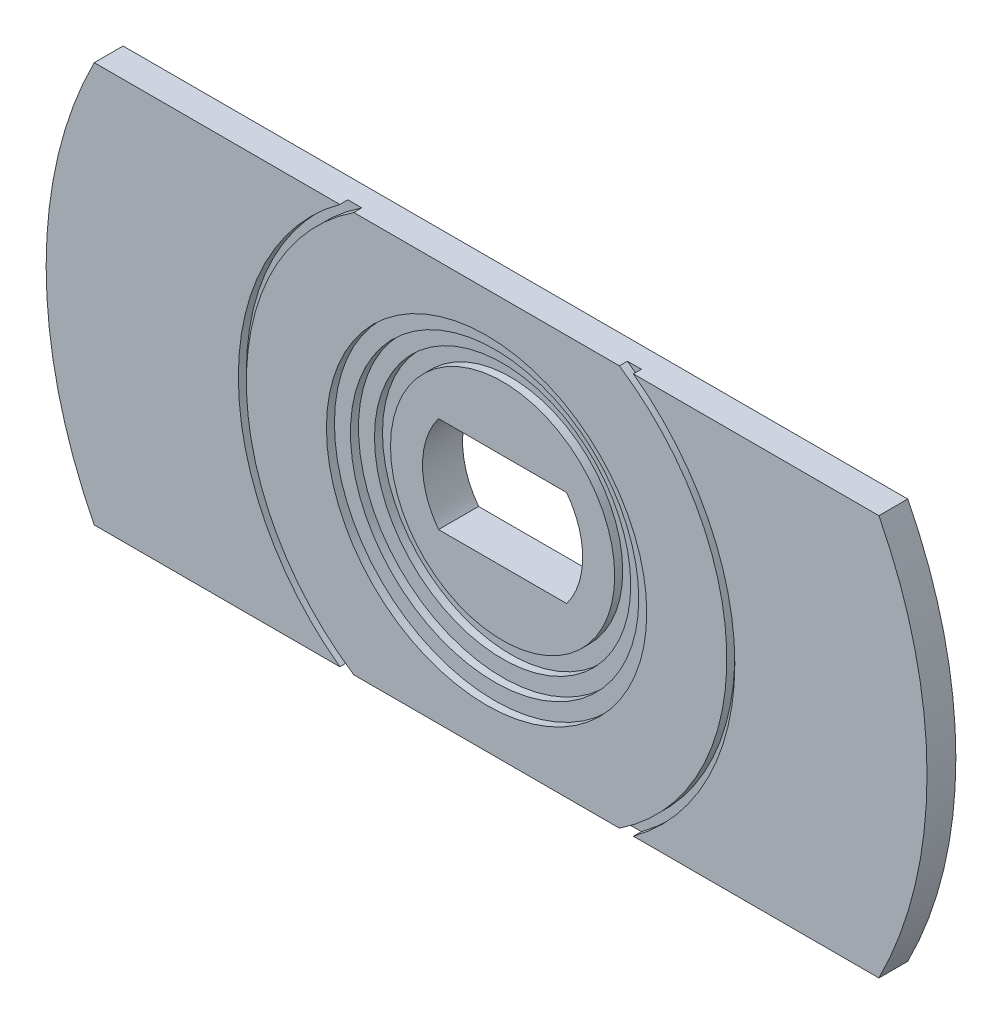
ISO-10303-21;
HEADER;
FILE_DESCRIPTION(('STEP AP214'),'2;1');
FILE_NAME('part.step','',(''),(''),'','','');
FILE_SCHEMA(('AUTOMOTIVE_DESIGN { 1 0 10303 214 1 1 1 1 }'));
ENDSEC;
DATA;
#1=APPLICATION_CONTEXT('core data for automotive mechanical design processes');
#2=APPLICATION_PROTOCOL_DEFINITION('international standard','automotive_design',2000,#1);
#3=PRODUCT_CONTEXT('',#1,'mechanical');
#4=PRODUCT('Part','Part','',(#3));
#5=PRODUCT_RELATED_PRODUCT_CATEGORY('part','',(#4));
#6=PRODUCT_DEFINITION_FORMATION('','',#4);
#7=PRODUCT_DEFINITION_CONTEXT('part definition',#1,'design');
#8=PRODUCT_DEFINITION('design','',#6,#7);
#9=PRODUCT_DEFINITION_SHAPE('','',#8);
#10=(LENGTH_UNIT() NAMED_UNIT(*) SI_UNIT(.MILLI.,.METRE.));
#11=(NAMED_UNIT(*) PLANE_ANGLE_UNIT() SI_UNIT($,.RADIAN.));
#12=(NAMED_UNIT(*) SI_UNIT($,.STERADIAN.) SOLID_ANGLE_UNIT());
#13=UNCERTAINTY_MEASURE_WITH_UNIT(LENGTH_MEASURE(1.E-05),#10,'distance_accuracy_value','');
#14=(GEOMETRIC_REPRESENTATION_CONTEXT(3) GLOBAL_UNCERTAINTY_ASSIGNED_CONTEXT((#13)) GLOBAL_UNIT_ASSIGNED_CONTEXT((#10,
#11,#12)) REPRESENTATION_CONTEXT('',''));
#15=CARTESIAN_POINT('',(0.,0.,0.));
#16=DIRECTION('',(0.,0.,1.));
#17=DIRECTION('',(1.,0.,0.));
#18=AXIS2_PLACEMENT_3D('',#15,#16,#17);
#19=CARTESIAN_POINT('',(0.,0.,1.48351648351648));
#20=DIRECTION('',(0.,0.,1.));
#21=DIRECTION('',(1.,0.,0.));
#22=AXIS2_PLACEMENT_3D('',#19,#20,#21);
#23=CYLINDRICAL_SURFACE('',#22,15.);
#24=CARTESIAN_POINT('',(0.,0.,-0.500000000000002));
#25=DIRECTION('',(0.,0.,1.));
#26=DIRECTION('',(1.,0.,0.));
#27=AXIS2_PLACEMENT_3D('',#24,#25,#26);
#28=CIRCLE('',#27,15.);
#29=CARTESIAN_POINT('',(8.2915619758885,-12.5,-0.500000000000002));
#30=VERTEX_POINT('',#29);
#31=CARTESIAN_POINT('',(8.2915619758885,12.5,-0.500000000000002));
#32=VERTEX_POINT('',#31);
#33=EDGE_CURVE('E309',#30,#32,#28,.T.);
#34=ORIENTED_EDGE('',*,*,#33,.T.);
#35=DIRECTION('',(0.,0.,1.));
#36=VECTOR('',#35,1.);
#37=CARTESIAN_POINT('',(8.2915619758885,12.5,1.48351648351648));
#38=LINE('',#37,#36);
#39=CARTESIAN_POINT('',(8.2915619758885,12.5,0.));
#40=VERTEX_POINT('',#39);
#41=EDGE_CURVE('E285',#32,#40,#38,.T.);
#42=ORIENTED_EDGE('',*,*,#41,.T.);
#43=CARTESIAN_POINT('',(0.,0.,0.));
#44=DIRECTION('',(0.,0.,1.));
#45=DIRECTION('',(1.,0.,0.));
#46=AXIS2_PLACEMENT_3D('',#43,#44,#45);
#47=CIRCLE('',#46,15.);
#48=CARTESIAN_POINT('',(8.2915619758885,-12.5,0.));
#49=VERTEX_POINT('',#48);
#50=EDGE_CURVE('E314',#49,#40,#47,.T.);
#51=ORIENTED_EDGE('',*,*,#50,.F.);
#52=DIRECTION('',(0.,0.,1.));
#53=VECTOR('',#52,1.);
#54=CARTESIAN_POINT('',(8.2915619758885,-12.5,1.48351648351648));
#55=LINE('',#54,#53);
#56=EDGE_CURVE('E255',#49,#30,#55,.F.);
#57=ORIENTED_EDGE('',*,*,#56,.T.);
#58=EDGE_LOOP('',(#34,#42,#51,#57));
#59=FACE_BOUND('',#58,.T.);
#60=ADVANCED_FACE('F40',(#59),#23,.T.);
#61=CARTESIAN_POINT('',(0.,15.,-0.500000000000002));
#62=DIRECTION('',(0.,0.,-1.));
#63=DIRECTION('',(-1.,0.,0.));
#64=AXIS2_PLACEMENT_3D('',#61,#62,#63);
#65=PLANE('',#64);
#66=CARTESIAN_POINT('',(0.,0.,-0.500000000000002));
#67=DIRECTION('',(0.,0.,1.));
#68=DIRECTION('',(1.,0.,0.));
#69=AXIS2_PLACEMENT_3D('',#66,#67,#68);
#70=CIRCLE('',#69,15.5);
#71=CARTESIAN_POINT('',(9.16515138991168,-12.5,-0.500000000000002));
#72=VERTEX_POINT('',#71);
#73=CARTESIAN_POINT('',(9.16515138991168,12.5,-0.500000000000002));
#74=VERTEX_POINT('',#73);
#75=EDGE_CURVE('E304',#72,#74,#70,.T.);
#76=ORIENTED_EDGE('',*,*,#75,.T.);
#77=DIRECTION('',(-1.,0.,0.));
#78=VECTOR('',#77,1.);
#79=CARTESIAN_POINT('',(0.,12.5,-0.500000000000002));
#80=LINE('',#79,#78);
#81=EDGE_CURVE('E277',#74,#32,#80,.T.);
#82=ORIENTED_EDGE('',*,*,#81,.T.);
#83=ORIENTED_EDGE('',*,*,#33,.F.);
#84=DIRECTION('',(1.,0.,0.));
#85=VECTOR('',#84,1.);
#86=CARTESIAN_POINT('',(0.,-12.5,-0.500000000000002));
#87=LINE('',#86,#85);
#88=EDGE_CURVE('E251',#30,#72,#87,.T.);
#89=ORIENTED_EDGE('',*,*,#88,.T.);
#90=EDGE_LOOP('',(#76,#82,#83,#89));
#91=FACE_BOUND('',#90,.T.);
#92=ADVANCED_FACE('F387',(#91),#65,.F.);
#93=CARTESIAN_POINT('',(0.,0.,1.48351648351648));
#94=DIRECTION('',(0.,0.,1.));
#95=DIRECTION('',(1.,0.,0.));
#96=AXIS2_PLACEMENT_3D('',#93,#94,#95);
#97=CYLINDRICAL_SURFACE('',#96,15.5);
#98=CARTESIAN_POINT('',(0.,0.,0.));
#99=DIRECTION('',(0.,0.,1.));
#100=DIRECTION('',(1.,0.,0.));
#101=AXIS2_PLACEMENT_3D('',#98,#99,#100);
#102=CIRCLE('',#101,15.5);
#103=CARTESIAN_POINT('',(9.16515138991165,-12.5,0.));
#104=VERTEX_POINT('',#103);
#105=CARTESIAN_POINT('',(9.16515138991166,12.5,0.));
#106=VERTEX_POINT('',#105);
#107=EDGE_CURVE('E299',#104,#106,#102,.T.);
#108=ORIENTED_EDGE('',*,*,#107,.T.);
#109=DIRECTION('',(0.,0.,1.));
#110=VECTOR('',#109,1.);
#111=CARTESIAN_POINT('',(9.16515138991168,12.5,1.48351648351648));
#112=LINE('',#111,#110);
#113=EDGE_CURVE('E281',#106,#74,#112,.F.);
#114=ORIENTED_EDGE('',*,*,#113,.T.);
#115=ORIENTED_EDGE('',*,*,#75,.F.);
#116=DIRECTION('',(0.,0.,1.));
#117=VECTOR('',#116,1.);
#118=CARTESIAN_POINT('',(9.16515138991168,-12.5,1.48351648351648));
#119=LINE('',#118,#117);
#120=EDGE_CURVE('E235',#72,#104,#119,.T.);
#121=ORIENTED_EDGE('',*,*,#120,.T.);
#122=EDGE_LOOP('',(#108,#114,#115,#121));
#123=FACE_BOUND('',#122,.T.);
#124=ADVANCED_FACE('F439',(#123),#97,.F.);
#125=CARTESIAN_POINT('',(0.,27.5,0.));
#126=DIRECTION('',(0.,0.,-1.));
#127=DIRECTION('',(-1.,0.,0.));
#128=AXIS2_PLACEMENT_3D('',#125,#126,#127);
#129=PLANE('',#128);
#130=CARTESIAN_POINT('',(0.,0.,0.));
#131=DIRECTION('',(0.,0.,1.));
#132=DIRECTION('',(1.,0.,0.));
#133=AXIS2_PLACEMENT_3D('',#130,#131,#132);
#134=CIRCLE('',#133,27.5);
#135=CARTESIAN_POINT('',(24.4948974278318,-12.5,0.));
#136=VERTEX_POINT('',#135);
#137=CARTESIAN_POINT('',(24.4948974278318,12.5,0.));
#138=VERTEX_POINT('',#137);
#139=EDGE_CURVE('E294',#136,#138,#134,.T.);
#140=ORIENTED_EDGE('',*,*,#139,.T.);
#141=DIRECTION('',(1.,0.,0.));
#142=VECTOR('',#141,1.);
#143=CARTESIAN_POINT('',(-24.4948974278318,12.5,0.));
#144=LINE('',#143,#142);
#145=EDGE_CURVE('E227',#106,#138,#144,.T.);
#146=ORIENTED_EDGE('',*,*,#145,.F.);
#147=ORIENTED_EDGE('',*,*,#107,.F.);
#148=DIRECTION('',(-1.,0.,0.));
#149=VECTOR('',#148,1.);
#150=CARTESIAN_POINT('',(-24.4948974278318,-12.5,0.));
#151=LINE('',#150,#149);
#152=EDGE_CURVE('E236',#136,#104,#151,.T.);
#153=ORIENTED_EDGE('',*,*,#152,.F.);
#154=EDGE_LOOP('',(#140,#146,#147,#153));
#155=FACE_BOUND('',#154,.T.);
#156=ADVANCED_FACE('F436',(#155),#129,.F.);
#157=CARTESIAN_POINT('',(0.,0.,1.48351648351648));
#158=DIRECTION('',(0.,0.,1.));
#159=DIRECTION('',(1.,0.,0.));
#160=AXIS2_PLACEMENT_3D('',#157,#158,#159);
#161=CYLINDRICAL_SURFACE('',#160,27.5);
#162=CARTESIAN_POINT('',(0.,0.,-1.8));
#163=DIRECTION('',(0.,0.,1.));
#164=DIRECTION('',(1.,0.,0.));
#165=AXIS2_PLACEMENT_3D('',#162,#163,#164);
#166=CIRCLE('',#165,27.5);
#167=CARTESIAN_POINT('',(24.4948974278318,-12.5,-1.8));
#168=VERTEX_POINT('',#167);
#169=CARTESIAN_POINT('',(24.4948974278318,12.5,-1.8));
#170=VERTEX_POINT('',#169);
#171=EDGE_CURVE('E289',#168,#170,#166,.T.);
#172=ORIENTED_EDGE('',*,*,#171,.T.);
#173=DIRECTION('',(0.,0.,1.));
#174=VECTOR('',#173,1.);
#175=CARTESIAN_POINT('',(24.4948974278318,12.5,-53.034753829798));
#176=LINE('',#175,#174);
#177=EDGE_CURVE('E64',#170,#138,#176,.T.);
#178=ORIENTED_EDGE('',*,*,#177,.T.);
#179=ORIENTED_EDGE('',*,*,#139,.F.);
#180=DIRECTION('',(0.,0.,1.));
#181=VECTOR('',#180,1.);
#182=CARTESIAN_POINT('',(24.4948974278318,-12.5,-53.034753829798));
#183=LINE('',#182,#181);
#184=EDGE_CURVE('E239',#168,#136,#183,.T.);
#185=ORIENTED_EDGE('',*,*,#184,.F.);
#186=EDGE_LOOP('',(#172,#178,#179,#185));
#187=FACE_BOUND('',#186,.T.);
#188=ADVANCED_FACE('F433',(#187),#161,.T.);
#189=CARTESIAN_POINT('',(0.,7.,-1.5));
#190=DIRECTION('',(0.,0.,-1.));
#191=DIRECTION('',(-1.,0.,0.));
#192=AXIS2_PLACEMENT_3D('',#189,#190,#191);
#193=PLANE('',#192);
#194=CARTESIAN_POINT('',(0.,0.,-1.5));
#195=DIRECTION('',(0.,0.,1.));
#196=DIRECTION('',(1.,0.,0.));
#197=AXIS2_PLACEMENT_3D('',#194,#195,#196);
#198=CIRCLE('',#197,7.);
#199=CARTESIAN_POINT('',(7.,0.,-1.5));
#200=VERTEX_POINT('',#199);
#201=EDGE_CURVE('E11',#200,#200,#198,.T.);
#202=ORIENTED_EDGE('',*,*,#201,.F.);
#203=EDGE_LOOP('',(#202));
#204=FACE_BOUND('',#203,.T.);
#205=CARTESIAN_POINT('',(0.,0.,-1.5));
#206=DIRECTION('',(0.,0.,1.));
#207=DIRECTION('',(1.,0.,0.));
#208=AXIS2_PLACEMENT_3D('',#205,#206,#207);
#209=CIRCLE('',#208,8.);
#210=CARTESIAN_POINT('',(8.,0.,-1.5));
#211=VERTEX_POINT('',#210);
#212=EDGE_CURVE('E49',#211,#211,#209,.T.);
#213=ORIENTED_EDGE('',*,*,#212,.T.);
#214=EDGE_LOOP('',(#213));
#215=FACE_BOUND('',#214,.T.);
#216=ADVANCED_FACE('F42',(#204,#215),#193,.F.);
#217=CARTESIAN_POINT('',(0.,0.,1.48351648351648));
#218=DIRECTION('',(0.,0.,1.));
#219=DIRECTION('',(1.,0.,0.));
#220=AXIS2_PLACEMENT_3D('',#217,#218,#219);
#221=CYLINDRICAL_SURFACE('',#220,8.);
#222=ORIENTED_EDGE('',*,*,#212,.F.);
#223=EDGE_LOOP('',(#222));
#224=FACE_BOUND('',#223,.T.);
#225=CARTESIAN_POINT('',(0.,0.,-1.));
#226=DIRECTION('',(0.,0.,1.));
#227=DIRECTION('',(1.,0.,0.));
#228=AXIS2_PLACEMENT_3D('',#225,#226,#227);
#229=CIRCLE('',#228,8.);
#230=CARTESIAN_POINT('',(8.,0.,-1.));
#231=VERTEX_POINT('',#230);
#232=EDGE_CURVE('E335',#231,#231,#229,.T.);
#233=ORIENTED_EDGE('',*,*,#232,.T.);
#234=EDGE_LOOP('',(#233));
#235=FACE_BOUND('',#234,.T.);
#236=ADVANCED_FACE('F343',(#224,#235),#221,.F.);
#237=CARTESIAN_POINT('',(0.,8.,-1.));
#238=DIRECTION('',(0.,0.,-1.));
#239=DIRECTION('',(-1.,0.,0.));
#240=AXIS2_PLACEMENT_3D('',#237,#238,#239);
#241=PLANE('',#240);
#242=ORIENTED_EDGE('',*,*,#232,.F.);
#243=EDGE_LOOP('',(#242));
#244=FACE_BOUND('',#243,.T.);
#245=CARTESIAN_POINT('',(0.,0.,-1.));
#246=DIRECTION('',(0.,0.,1.));
#247=DIRECTION('',(1.,0.,0.));
#248=AXIS2_PLACEMENT_3D('',#245,#246,#247);
#249=CIRCLE('',#248,9.);
#250=CARTESIAN_POINT('',(9.,0.,-1.));
#251=VERTEX_POINT('',#250);
#252=EDGE_CURVE('E331',#251,#251,#249,.T.);
#253=ORIENTED_EDGE('',*,*,#252,.T.);
#254=EDGE_LOOP('',(#253));
#255=FACE_BOUND('',#254,.T.);
#256=ADVANCED_FACE('F346',(#244,#255),#241,.F.);
#257=CARTESIAN_POINT('',(0.,0.,1.48351648351648));
#258=DIRECTION('',(0.,0.,1.));
#259=DIRECTION('',(1.,0.,0.));
#260=AXIS2_PLACEMENT_3D('',#257,#258,#259);
#261=CYLINDRICAL_SURFACE('',#260,9.);
#262=ORIENTED_EDGE('',*,*,#252,.F.);
#263=EDGE_LOOP('',(#262));
#264=FACE_BOUND('',#263,.T.);
#265=CARTESIAN_POINT('',(0.,0.,-0.500000000000003));
#266=DIRECTION('',(0.,0.,1.));
#267=DIRECTION('',(1.,0.,0.));
#268=AXIS2_PLACEMENT_3D('',#265,#266,#267);
#269=CIRCLE('',#268,9.);
#270=CARTESIAN_POINT('',(9.,0.,-0.500000000000003));
#271=VERTEX_POINT('',#270);
#272=EDGE_CURVE('E327',#271,#271,#269,.T.);
#273=ORIENTED_EDGE('',*,*,#272,.T.);
#274=EDGE_LOOP('',(#273));
#275=FACE_BOUND('',#274,.T.);
#276=ADVANCED_FACE('F351',(#264,#275),#261,.F.);
#277=CARTESIAN_POINT('',(0.,9.,-0.500000000000003));
#278=DIRECTION('',(0.,0.,-1.));
#279=DIRECTION('',(-1.,0.,0.));
#280=AXIS2_PLACEMENT_3D('',#277,#278,#279);
#281=PLANE('',#280);
#282=ORIENTED_EDGE('',*,*,#272,.F.);
#283=EDGE_LOOP('',(#282));
#284=FACE_BOUND('',#283,.T.);
#285=CARTESIAN_POINT('',(0.,0.,-0.500000000000003));
#286=DIRECTION('',(0.,0.,1.));
#287=DIRECTION('',(1.,0.,0.));
#288=AXIS2_PLACEMENT_3D('',#285,#286,#287);
#289=CIRCLE('',#288,10.);
#290=CARTESIAN_POINT('',(10.,0.,-0.500000000000003));
#291=VERTEX_POINT('',#290);
#292=EDGE_CURVE('E323',#291,#291,#289,.T.);
#293=ORIENTED_EDGE('',*,*,#292,.T.);
#294=EDGE_LOOP('',(#293));
#295=FACE_BOUND('',#294,.T.);
#296=ADVANCED_FACE('F357',(#284,#295),#281,.F.);
#297=CARTESIAN_POINT('',(0.,0.,1.48351648351648));
#298=DIRECTION('',(0.,0.,1.));
#299=DIRECTION('',(1.,0.,0.));
#300=AXIS2_PLACEMENT_3D('',#297,#298,#299);
#301=CYLINDRICAL_SURFACE('',#300,10.);
#302=ORIENTED_EDGE('',*,*,#292,.F.);
#303=EDGE_LOOP('',(#302));
#304=FACE_BOUND('',#303,.T.);
#305=CARTESIAN_POINT('',(0.,0.,0.));
#306=DIRECTION('',(0.,0.,1.));
#307=DIRECTION('',(1.,0.,0.));
#308=AXIS2_PLACEMENT_3D('',#305,#306,#307);
#309=CIRCLE('',#308,10.);
#310=CARTESIAN_POINT('',(10.,0.,0.));
#311=VERTEX_POINT('',#310);
#312=EDGE_CURVE('E319',#311,#311,#309,.T.);
#313=ORIENTED_EDGE('',*,*,#312,.T.);
#314=EDGE_LOOP('',(#313));
#315=FACE_BOUND('',#314,.T.);
#316=ADVANCED_FACE('F363',(#304,#315),#301,.F.);
#317=CARTESIAN_POINT('',(0.,15.,0.));
#318=DIRECTION('',(0.,0.,-1.));
#319=DIRECTION('',(-1.,0.,0.));
#320=AXIS2_PLACEMENT_3D('',#317,#318,#319);
#321=PLANE('',#320);
#322=ORIENTED_EDGE('',*,*,#312,.F.);
#323=EDGE_LOOP('',(#322));
#324=FACE_BOUND('',#323,.T.);
#325=ORIENTED_EDGE('',*,*,#50,.T.);
#326=CARTESIAN_POINT('',(-8.2915619758885,12.5,0.));
#327=VERTEX_POINT('',#326);
#328=EDGE_CURVE('E226',#327,#40,#144,.T.);
#329=ORIENTED_EDGE('',*,*,#328,.F.);
#330=CARTESIAN_POINT('',(-8.2915619758885,-12.5,0.));
#331=VERTEX_POINT('',#330);
#332=EDGE_CURVE('E318',#327,#331,#47,.T.);
#333=ORIENTED_EDGE('',*,*,#332,.T.);
#334=EDGE_CURVE('E240',#49,#331,#151,.T.);
#335=ORIENTED_EDGE('',*,*,#334,.F.);
#336=EDGE_LOOP('',(#325,#329,#333,#335));
#337=FACE_BOUND('',#336,.T.);
#338=ADVANCED_FACE('F369',(#324,#337),#321,.F.);
#339=ORIENTED_EDGE('',*,*,#332,.F.);
#340=DIRECTION('',(0.,0.,1.));
#341=VECTOR('',#340,1.);
#342=CARTESIAN_POINT('',(-8.2915619758885,12.5,1.48351648351648));
#343=LINE('',#342,#341);
#344=CARTESIAN_POINT('',(-8.2915619758885,12.5,-0.500000000000002));
#345=VERTEX_POINT('',#344);
#346=EDGE_CURVE('E276',#327,#345,#343,.F.);
#347=ORIENTED_EDGE('',*,*,#346,.T.);
#348=CARTESIAN_POINT('',(-8.2915619758885,-12.5,-0.500000000000002));
#349=VERTEX_POINT('',#348);
#350=EDGE_CURVE('E313',#345,#349,#28,.T.);
#351=ORIENTED_EDGE('',*,*,#350,.T.);
#352=DIRECTION('',(0.,0.,1.));
#353=VECTOR('',#352,1.);
#354=CARTESIAN_POINT('',(-8.2915619758885,-12.5,1.48351648351648));
#355=LINE('',#354,#353);
#356=EDGE_CURVE('E264',#349,#331,#355,.T.);
#357=ORIENTED_EDGE('',*,*,#356,.T.);
#358=EDGE_LOOP('',(#339,#347,#351,#357));
#359=FACE_BOUND('',#358,.T.);
#360=ADVANCED_FACE('F375',(#359),#23,.T.);
#361=ORIENTED_EDGE('',*,*,#350,.F.);
#362=CARTESIAN_POINT('',(-9.16515138991168,12.5,-0.500000000000002));
#363=VERTEX_POINT('',#362);
#364=EDGE_CURVE('E272',#345,#363,#80,.T.);
#365=ORIENTED_EDGE('',*,*,#364,.T.);
#366=CARTESIAN_POINT('',(-9.16515138991168,-12.5,-0.500000000000002));
#367=VERTEX_POINT('',#366);
#368=EDGE_CURVE('E308',#363,#367,#70,.T.);
#369=ORIENTED_EDGE('',*,*,#368,.T.);
#370=EDGE_CURVE('E256',#367,#349,#87,.T.);
#371=ORIENTED_EDGE('',*,*,#370,.T.);
#372=EDGE_LOOP('',(#361,#365,#369,#371));
#373=FACE_BOUND('',#372,.T.);
#374=ADVANCED_FACE('F421',(#373),#65,.F.);
#375=ORIENTED_EDGE('',*,*,#368,.F.);
#376=DIRECTION('',(0.,0.,1.));
#377=VECTOR('',#376,1.);
#378=CARTESIAN_POINT('',(-9.16515138991168,12.5,1.48351648351648));
#379=LINE('',#378,#377);
#380=CARTESIAN_POINT('',(-9.16515138991168,12.5,0.));
#381=VERTEX_POINT('',#380);
#382=EDGE_CURVE('E268',#363,#381,#379,.T.);
#383=ORIENTED_EDGE('',*,*,#382,.T.);
#384=CARTESIAN_POINT('',(-9.16515138991168,-12.5,0.));
#385=VERTEX_POINT('',#384);
#386=EDGE_CURVE('E303',#381,#385,#102,.T.);
#387=ORIENTED_EDGE('',*,*,#386,.T.);
#388=DIRECTION('',(0.,0.,1.));
#389=VECTOR('',#388,1.);
#390=CARTESIAN_POINT('',(-9.16515138991168,-12.5,1.48351648351648));
#391=LINE('',#390,#389);
#392=EDGE_CURVE('E260',#385,#367,#391,.F.);
#393=ORIENTED_EDGE('',*,*,#392,.T.);
#394=EDGE_LOOP('',(#375,#383,#387,#393));
#395=FACE_BOUND('',#394,.T.);
#396=ADVANCED_FACE('F424',(#395),#97,.F.);
#397=ORIENTED_EDGE('',*,*,#386,.F.);
#398=CARTESIAN_POINT('',(-24.4948974278318,12.5,0.));
#399=VERTEX_POINT('',#398);
#400=EDGE_CURVE('E222',#399,#381,#144,.T.);
#401=ORIENTED_EDGE('',*,*,#400,.F.);
#402=CARTESIAN_POINT('',(-24.4948974278318,-12.5,0.));
#403=VERTEX_POINT('',#402);
#404=EDGE_CURVE('E298',#399,#403,#134,.T.);
#405=ORIENTED_EDGE('',*,*,#404,.T.);
#406=EDGE_CURVE('E221',#385,#403,#151,.T.);
#407=ORIENTED_EDGE('',*,*,#406,.F.);
#408=EDGE_LOOP('',(#397,#401,#405,#407));
#409=FACE_BOUND('',#408,.T.);
#410=ADVANCED_FACE('F409',(#409),#129,.F.);
#411=ORIENTED_EDGE('',*,*,#404,.F.);
#412=DIRECTION('',(0.,0.,1.));
#413=VECTOR('',#412,1.);
#414=CARTESIAN_POINT('',(-24.4948974278318,12.5,-53.034753829798));
#415=LINE('',#414,#413);
#416=CARTESIAN_POINT('',(-24.4948974278318,12.5,-1.8));
#417=VERTEX_POINT('',#416);
#418=EDGE_CURVE('E225',#417,#399,#415,.T.);
#419=ORIENTED_EDGE('',*,*,#418,.F.);
#420=CARTESIAN_POINT('',(-24.4948974278318,-12.5,-1.8));
#421=VERTEX_POINT('',#420);
#422=EDGE_CURVE('E293',#417,#421,#166,.T.);
#423=ORIENTED_EDGE('',*,*,#422,.T.);
#424=DIRECTION('',(0.,0.,1.));
#425=VECTOR('',#424,1.);
#426=CARTESIAN_POINT('',(-24.4948974278318,-12.5,-53.034753829798));
#427=LINE('',#426,#425);
#428=EDGE_CURVE('E56',#421,#403,#427,.T.);
#429=ORIENTED_EDGE('',*,*,#428,.T.);
#430=EDGE_LOOP('',(#411,#419,#423,#429));
#431=FACE_BOUND('',#430,.T.);
#432=ADVANCED_FACE('F405',(#431),#161,.T.);
#433=CARTESIAN_POINT('',(0.,27.5,-1.8));
#434=DIRECTION('',(0.,0.,1.));
#435=DIRECTION('',(1.,0.,0.));
#436=AXIS2_PLACEMENT_3D('',#433,#434,#435);
#437=PLANE('',#436);
#438=ORIENTED_EDGE('',*,*,#422,.F.);
#439=DIRECTION('',(-1.,0.,0.));
#440=VECTOR('',#439,1.);
#441=CARTESIAN_POINT('',(-24.4948974278318,12.5,-1.8));
#442=LINE('',#441,#440);
#443=EDGE_CURVE('E230',#170,#417,#442,.T.);
#444=ORIENTED_EDGE('',*,*,#443,.F.);
#445=ORIENTED_EDGE('',*,*,#171,.F.);
#446=DIRECTION('',(1.,0.,0.));
#447=VECTOR('',#446,1.);
#448=CARTESIAN_POINT('',(-24.4948974278318,-12.5,-1.8));
#449=LINE('',#448,#447);
#450=EDGE_CURVE('E243',#421,#168,#449,.T.);
#451=ORIENTED_EDGE('',*,*,#450,.F.);
#452=EDGE_LOOP('',(#438,#444,#445,#451));
#453=FACE_BOUND('',#452,.T.);
#454=CARTESIAN_POINT('',(0.,0.,-1.8));
#455=DIRECTION('',(0.,0.,1.));
#456=DIRECTION('',(1.,0.,0.));
#457=AXIS2_PLACEMENT_3D('',#454,#455,#456);
#458=CIRCLE('',#457,7.);
#459=CARTESIAN_POINT('',(7.,0.,-1.8));
#460=VERTEX_POINT('',#459);
#461=EDGE_CURVE('E217',#460,#460,#458,.F.);
#462=ORIENTED_EDGE('',*,*,#461,.F.);
#463=EDGE_LOOP('',(#462));
#464=FACE_BOUND('',#463,.T.);
#465=ADVANCED_FACE('F426',(#453,#464),#437,.F.);
#466=CARTESIAN_POINT('',(-24.4948974278318,-12.5,-53.034753829798));
#467=DIRECTION('',(0.,1.,0.));
#468=DIRECTION('',(0.,0.,1.));
#469=AXIS2_PLACEMENT_3D('',#466,#467,#468);
#470=PLANE('',#469);
#471=ORIENTED_EDGE('',*,*,#370,.F.);
#472=ORIENTED_EDGE('',*,*,#392,.F.);
#473=ORIENTED_EDGE('',*,*,#406,.T.);
#474=ORIENTED_EDGE('',*,*,#428,.F.);
#475=ORIENTED_EDGE('',*,*,#450,.T.);
#476=ORIENTED_EDGE('',*,*,#184,.T.);
#477=ORIENTED_EDGE('',*,*,#152,.T.);
#478=ORIENTED_EDGE('',*,*,#120,.F.);
#479=ORIENTED_EDGE('',*,*,#88,.F.);
#480=ORIENTED_EDGE('',*,*,#56,.F.);
#481=ORIENTED_EDGE('',*,*,#334,.T.);
#482=ORIENTED_EDGE('',*,*,#356,.F.);
#483=EDGE_LOOP('',(#471,#472,#473,#474,#475,#476,#477,#478,#479,#480,#481,#482));
#484=FACE_BOUND('',#483,.T.);
#485=ADVANCED_FACE('F397',(#484),#470,.F.);
#486=CARTESIAN_POINT('',(-24.4948974278318,12.5,-53.034753829798));
#487=DIRECTION('',(0.,-1.,0.));
#488=DIRECTION('',(0.,0.,-1.));
#489=AXIS2_PLACEMENT_3D('',#486,#487,#488);
#490=PLANE('',#489);
#491=ORIENTED_EDGE('',*,*,#81,.F.);
#492=ORIENTED_EDGE('',*,*,#113,.F.);
#493=ORIENTED_EDGE('',*,*,#145,.T.);
#494=ORIENTED_EDGE('',*,*,#177,.F.);
#495=ORIENTED_EDGE('',*,*,#443,.T.);
#496=ORIENTED_EDGE('',*,*,#418,.T.);
#497=ORIENTED_EDGE('',*,*,#400,.T.);
#498=ORIENTED_EDGE('',*,*,#382,.F.);
#499=ORIENTED_EDGE('',*,*,#364,.F.);
#500=ORIENTED_EDGE('',*,*,#346,.F.);
#501=ORIENTED_EDGE('',*,*,#328,.T.);
#502=ORIENTED_EDGE('',*,*,#41,.F.);
#503=EDGE_LOOP('',(#491,#492,#493,#494,#495,#496,#497,#498,#499,#500,#501,#502));
#504=FACE_BOUND('',#503,.T.);
#505=ADVANCED_FACE('F385',(#504),#490,.F.);
#506=CARTESIAN_POINT('',(0.,0.,-1.));
#507=DIRECTION('',(0.,0.,-1.));
#508=DIRECTION('',(-1.,0.,0.));
#509=AXIS2_PLACEMENT_3D('',#506,#507,#508);
#510=CYLINDRICAL_SURFACE('',#509,7.);
#511=CARTESIAN_POINT('',(0.,0.,-1.));
#512=DIRECTION('',(0.,0.,1.));
#513=DIRECTION('',(1.,0.,0.));
#514=AXIS2_PLACEMENT_3D('',#511,#512,#513);
#515=CIRCLE('',#514,7.);
#516=CARTESIAN_POINT('',(7.,0.,-1.));
#517=VERTEX_POINT('',#516);
#518=EDGE_CURVE('E166',#517,#517,#515,.T.);
#519=ORIENTED_EDGE('',*,*,#518,.F.);
#520=EDGE_LOOP('',(#519));
#521=FACE_BOUND('',#520,.T.);
#522=ORIENTED_EDGE('',*,*,#201,.T.);
#523=EDGE_LOOP('',(#522));
#524=FACE_BOUND('',#523,.T.);
#525=ADVANCED_FACE('F492',(#521,#524),#510,.T.);
#526=CARTESIAN_POINT('',(0.,0.,-3.5));
#527=DIRECTION('',(0.,0.,1.));
#528=DIRECTION('',(1.,0.,0.));
#529=AXIS2_PLACEMENT_3D('',#526,#527,#528);
#530=CIRCLE('',#529,7.);
#531=CARTESIAN_POINT('',(7.,0.,-3.5));
#532=VERTEX_POINT('',#531);
#533=EDGE_CURVE('E190',#532,#532,#530,.T.);
#534=ORIENTED_EDGE('',*,*,#533,.T.);
#535=EDGE_LOOP('',(#534));
#536=FACE_BOUND('',#535,.T.);
#537=ORIENTED_EDGE('',*,*,#461,.T.);
#538=EDGE_LOOP('',(#537));
#539=FACE_BOUND('',#538,.T.);
#540=ADVANCED_FACE('F499',(#536,#539),#510,.T.);
#541=CARTESIAN_POINT('',(0.,0.,-1.));
#542=DIRECTION('',(0.,0.,1.));
#543=DIRECTION('',(1.,0.,0.));
#544=AXIS2_PLACEMENT_3D('',#541,#542,#543);
#545=PLANE('',#544);
#546=ORIENTED_EDGE('',*,*,#518,.T.);
#547=EDGE_LOOP('',(#546));
#548=FACE_BOUND('',#547,.T.);
#549=DIRECTION('',(-1.,0.,0.));
#550=VECTOR('',#549,1.);
#551=CARTESIAN_POINT('',(4.,3.,-1.));
#552=LINE('',#551,#550);
#553=CARTESIAN_POINT('',(4.,3.,-1.));
#554=VERTEX_POINT('',#553);
#555=CARTESIAN_POINT('',(-4.,3.,-1.));
#556=VERTEX_POINT('',#555);
#557=EDGE_CURVE('E196',#554,#556,#552,.T.);
#558=ORIENTED_EDGE('',*,*,#557,.F.);
#559=CARTESIAN_POINT('',(0.,0.,-1.));
#560=DIRECTION('',(0.,0.,1.));
#561=DIRECTION('',(1.,0.,0.));
#562=AXIS2_PLACEMENT_3D('',#559,#560,#561);
#563=CIRCLE('',#562,5.);
#564=CARTESIAN_POINT('',(4.,-3.,-1.));
#565=VERTEX_POINT('',#564);
#566=EDGE_CURVE('E162',#565,#554,#563,.T.);
#567=ORIENTED_EDGE('',*,*,#566,.F.);
#568=DIRECTION('',(1.,0.,0.));
#569=VECTOR('',#568,1.);
#570=CARTESIAN_POINT('',(4.,-3.,-1.));
#571=LINE('',#570,#569);
#572=CARTESIAN_POINT('',(-4.,-3.,-1.));
#573=VERTEX_POINT('',#572);
#574=EDGE_CURVE('E203',#573,#565,#571,.T.);
#575=ORIENTED_EDGE('',*,*,#574,.F.);
#576=CARTESIAN_POINT('',(0.,0.,-1.));
#577=DIRECTION('',(0.,0.,1.));
#578=DIRECTION('',(1.,0.,0.));
#579=AXIS2_PLACEMENT_3D('',#576,#577,#578);
#580=CIRCLE('',#579,5.);
#581=EDGE_CURVE('E199',#556,#573,#580,.T.);
#582=ORIENTED_EDGE('',*,*,#581,.F.);
#583=EDGE_LOOP('',(#558,#567,#575,#582));
#584=FACE_BOUND('',#583,.T.);
#585=ADVANCED_FACE('F507',(#548,#584),#545,.T.);
#586=CARTESIAN_POINT('',(0.,0.,-1.));
#587=DIRECTION('',(0.,0.,-1.));
#588=DIRECTION('',(-1.,0.,0.));
#589=AXIS2_PLACEMENT_3D('',#586,#587,#588);
#590=CYLINDRICAL_SURFACE('',#589,5.);
#591=DIRECTION('',(0.,0.,-1.));
#592=VECTOR('',#591,1.);
#593=CARTESIAN_POINT('',(4.,3.,-1.));
#594=LINE('',#593,#592);
#595=CARTESIAN_POINT('',(4.,3.,-3.5));
#596=VERTEX_POINT('',#595);
#597=EDGE_CURVE('E154',#554,#596,#594,.T.);
#598=ORIENTED_EDGE('',*,*,#597,.T.);
#599=CARTESIAN_POINT('',(0.,0.,-3.5));
#600=DIRECTION('',(0.,0.,1.));
#601=DIRECTION('',(1.,0.,0.));
#602=AXIS2_PLACEMENT_3D('',#599,#600,#601);
#603=CIRCLE('',#602,5.);
#604=CARTESIAN_POINT('',(4.,-3.,-3.5));
#605=VERTEX_POINT('',#604);
#606=EDGE_CURVE('E159',#605,#596,#603,.T.);
#607=ORIENTED_EDGE('',*,*,#606,.F.);
#608=DIRECTION('',(0.,0.,-1.));
#609=VECTOR('',#608,1.);
#610=CARTESIAN_POINT('',(4.,-3.,-1.));
#611=LINE('',#610,#609);
#612=EDGE_CURVE('E206',#565,#605,#611,.T.);
#613=ORIENTED_EDGE('',*,*,#612,.F.);
#614=ORIENTED_EDGE('',*,*,#566,.T.);
#615=EDGE_LOOP('',(#598,#607,#613,#614));
#616=FACE_BOUND('',#615,.T.);
#617=ADVANCED_FACE('F156',(#616),#590,.F.);
#618=CARTESIAN_POINT('',(4.,3.,-1.));
#619=DIRECTION('',(0.,-1.,0.));
#620=DIRECTION('',(0.,0.,-1.));
#621=AXIS2_PLACEMENT_3D('',#618,#619,#620);
#622=PLANE('',#621);
#623=DIRECTION('',(0.,0.,-1.));
#624=VECTOR('',#623,1.);
#625=CARTESIAN_POINT('',(-4.,3.,-1.));
#626=LINE('',#625,#624);
#627=CARTESIAN_POINT('',(-4.,3.,-3.5));
#628=VERTEX_POINT('',#627);
#629=EDGE_CURVE('E167',#556,#628,#626,.T.);
#630=ORIENTED_EDGE('',*,*,#629,.T.);
#631=DIRECTION('',(-1.,0.,0.));
#632=VECTOR('',#631,1.);
#633=CARTESIAN_POINT('',(4.,3.,-3.5));
#634=LINE('',#633,#632);
#635=EDGE_CURVE('E170',#596,#628,#634,.T.);
#636=ORIENTED_EDGE('',*,*,#635,.F.);
#637=ORIENTED_EDGE('',*,*,#597,.F.);
#638=ORIENTED_EDGE('',*,*,#557,.T.);
#639=EDGE_LOOP('',(#630,#636,#637,#638));
#640=FACE_BOUND('',#639,.T.);
#641=ADVANCED_FACE('F171',(#640),#622,.T.);
#642=CARTESIAN_POINT('',(0.,0.,-1.));
#643=DIRECTION('',(0.,0.,-1.));
#644=DIRECTION('',(-1.,0.,0.));
#645=AXIS2_PLACEMENT_3D('',#642,#643,#644);
#646=CYLINDRICAL_SURFACE('',#645,5.);
#647=DIRECTION('',(0.,0.,-1.));
#648=VECTOR('',#647,1.);
#649=CARTESIAN_POINT('',(-4.,-3.,-1.));
#650=LINE('',#649,#648);
#651=CARTESIAN_POINT('',(-4.,-3.,-3.5));
#652=VERTEX_POINT('',#651);
#653=EDGE_CURVE('E209',#573,#652,#650,.T.);
#654=ORIENTED_EDGE('',*,*,#653,.T.);
#655=CARTESIAN_POINT('',(0.,0.,-3.5));
#656=DIRECTION('',(0.,0.,1.));
#657=DIRECTION('',(1.,0.,0.));
#658=AXIS2_PLACEMENT_3D('',#655,#656,#657);
#659=CIRCLE('',#658,5.);
#660=EDGE_CURVE('E177',#628,#652,#659,.T.);
#661=ORIENTED_EDGE('',*,*,#660,.F.);
#662=ORIENTED_EDGE('',*,*,#629,.F.);
#663=ORIENTED_EDGE('',*,*,#581,.T.);
#664=EDGE_LOOP('',(#654,#661,#662,#663));
#665=FACE_BOUND('',#664,.T.);
#666=ADVANCED_FACE('F527',(#665),#646,.F.);
#667=CARTESIAN_POINT('',(4.,-3.,-1.));
#668=DIRECTION('',(0.,1.,0.));
#669=DIRECTION('',(0.,0.,1.));
#670=AXIS2_PLACEMENT_3D('',#667,#668,#669);
#671=PLANE('',#670);
#672=ORIENTED_EDGE('',*,*,#612,.T.);
#673=DIRECTION('',(1.,0.,0.));
#674=VECTOR('',#673,1.);
#675=CARTESIAN_POINT('',(4.,-3.,-3.5));
#676=LINE('',#675,#674);
#677=EDGE_CURVE('E182',#652,#605,#676,.T.);
#678=ORIENTED_EDGE('',*,*,#677,.F.);
#679=ORIENTED_EDGE('',*,*,#653,.F.);
#680=ORIENTED_EDGE('',*,*,#574,.T.);
#681=EDGE_LOOP('',(#672,#678,#679,#680));
#682=FACE_BOUND('',#681,.T.);
#683=ADVANCED_FACE('F534',(#682),#671,.T.);
#684=CARTESIAN_POINT('',(0.,0.,-3.5));
#685=DIRECTION('',(0.,0.,1.));
#686=DIRECTION('',(1.,0.,0.));
#687=AXIS2_PLACEMENT_3D('',#684,#685,#686);
#688=PLANE('',#687);
#689=ORIENTED_EDGE('',*,*,#677,.T.);
#690=ORIENTED_EDGE('',*,*,#606,.T.);
#691=ORIENTED_EDGE('',*,*,#635,.T.);
#692=ORIENTED_EDGE('',*,*,#660,.T.);
#693=EDGE_LOOP('',(#689,#690,#691,#692));
#694=FACE_BOUND('',#693,.T.);
#695=ORIENTED_EDGE('',*,*,#533,.F.);
#696=EDGE_LOOP('',(#695));
#697=FACE_BOUND('',#696,.T.);
#698=ADVANCED_FACE('F179',(#694,#697),#688,.F.);
#699=CLOSED_SHELL('',(#60,#92,#124,#156,#188,#216,#236,#256,#276,#296,#316,#338,#360,#374,#396,
#410,#432,#465,#485,#505,#525,#540,#585,#617,#641,#666,#683,#698));
#700=MANIFOLD_SOLID_BREP('B2',#699);
#701=ADVANCED_BREP_SHAPE_REPRESENTATION('',(#18,#700),#14);
#702=SHAPE_DEFINITION_REPRESENTATION(#9,#701);
ENDSEC;
END-ISO-10303-21;
